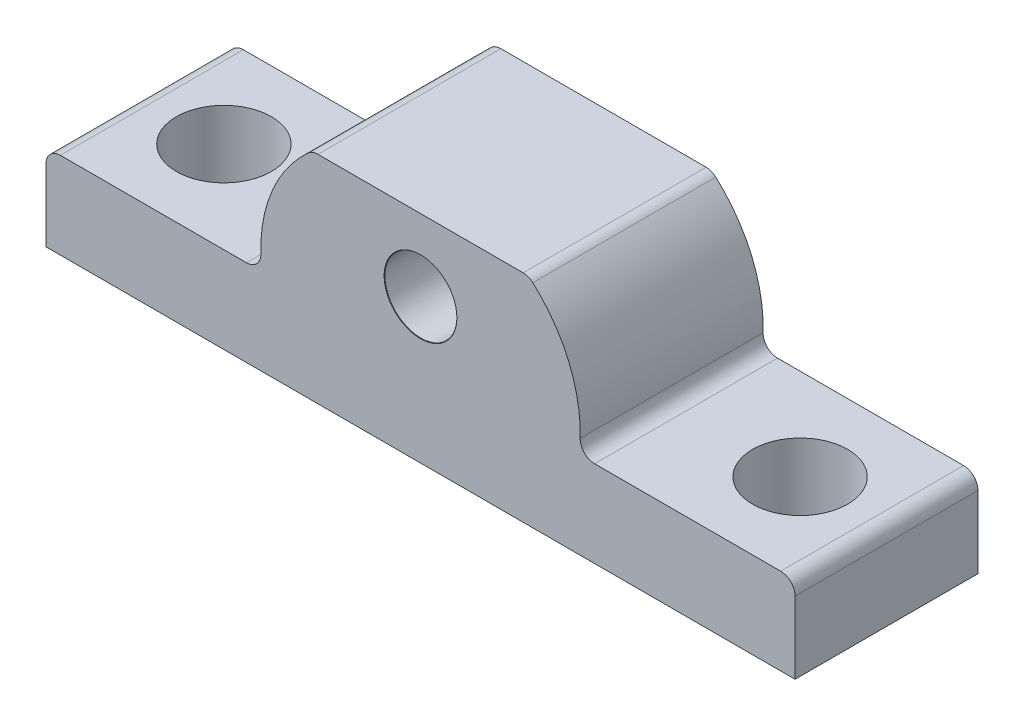
ISO-10303-21;
HEADER;
FILE_DESCRIPTION(('STEP AP214'),'2;1');
FILE_NAME('part.step','',(''),(''),'','','');
FILE_SCHEMA(('AUTOMOTIVE_DESIGN { 1 0 10303 214 1 1 1 1 }'));
ENDSEC;
DATA;
#1=APPLICATION_CONTEXT('core data for automotive mechanical design processes');
#2=APPLICATION_PROTOCOL_DEFINITION('international standard','automotive_design',2000,#1);
#3=PRODUCT_CONTEXT('',#1,'mechanical');
#4=PRODUCT('Part','Part','',(#3));
#5=PRODUCT_RELATED_PRODUCT_CATEGORY('part','',(#4));
#6=PRODUCT_DEFINITION_FORMATION('','',#4);
#7=PRODUCT_DEFINITION_CONTEXT('part definition',#1,'design');
#8=PRODUCT_DEFINITION('design','',#6,#7);
#9=PRODUCT_DEFINITION_SHAPE('','',#8);
#10=(LENGTH_UNIT() NAMED_UNIT(*) SI_UNIT(.MILLI.,.METRE.));
#11=(NAMED_UNIT(*) PLANE_ANGLE_UNIT() SI_UNIT($,.RADIAN.));
#12=(NAMED_UNIT(*) SI_UNIT($,.STERADIAN.) SOLID_ANGLE_UNIT());
#13=UNCERTAINTY_MEASURE_WITH_UNIT(LENGTH_MEASURE(1.E-05),#10,'distance_accuracy_value','');
#14=(GEOMETRIC_REPRESENTATION_CONTEXT(3) GLOBAL_UNCERTAINTY_ASSIGNED_CONTEXT((#13)) GLOBAL_UNIT_ASSIGNED_CONTEXT((#10,
#11,#12)) REPRESENTATION_CONTEXT('',''));
#15=CARTESIAN_POINT('',(0.,0.,0.));
#16=DIRECTION('',(0.,0.,1.));
#17=DIRECTION('',(1.,0.,0.));
#18=AXIS2_PLACEMENT_3D('',#15,#16,#17);
#19=CARTESIAN_POINT('',(-1.08830466278728,7.32600736886172,-12.7));
#20=DIRECTION('',(0.,0.,-1.));
#21=DIRECTION('',(-1.,0.,0.));
#22=AXIS2_PLACEMENT_3D('',#19,#20,#21);
#23=PLANE('',#22);
#24=DIRECTION('',(-1.,0.,0.));
#25=VECTOR('',#24,1.);
#26=CARTESIAN_POINT('',(26.,6.00000000000001,-12.7));
#27=LINE('',#26,#25);
#28=CARTESIAN_POINT('',(25.,6.00000000000001,-12.7));
#29=VERTEX_POINT('',#28);
#30=CARTESIAN_POINT('',(12.0834726558399,6.,-12.7));
#31=VERTEX_POINT('',#30);
#32=EDGE_CURVE('E166',#29,#31,#27,.T.);
#33=ORIENTED_EDGE('',*,*,#32,.F.);
#34=CARTESIAN_POINT('',(25.,5.00000000000001,-12.7));
#35=DIRECTION('',(0.,0.,-1.));
#36=DIRECTION('',(-1.,0.,0.));
#37=AXIS2_PLACEMENT_3D('',#34,#35,#36);
#38=CIRCLE('',#37,1.);
#39=CARTESIAN_POINT('',(26.,5.00000000000001,-12.7));
#40=VERTEX_POINT('',#39);
#41=EDGE_CURVE('E164',#29,#40,#38,.T.);
#42=ORIENTED_EDGE('',*,*,#41,.T.);
#43=DIRECTION('',(0.,1.,0.));
#44=VECTOR('',#43,1.);
#45=CARTESIAN_POINT('',(26.,0.,-12.7));
#46=LINE('',#45,#44);
#47=CARTESIAN_POINT('',(26.,0.,-12.7));
#48=VERTEX_POINT('',#47);
#49=EDGE_CURVE('E147',#48,#40,#46,.T.);
#50=ORIENTED_EDGE('',*,*,#49,.F.);
#51=DIRECTION('',(1.,0.,0.));
#52=VECTOR('',#51,1.);
#53=CARTESIAN_POINT('',(-26.,0.,-12.7));
#54=LINE('',#53,#52);
#55=CARTESIAN_POINT('',(-26.,0.,-12.7));
#56=VERTEX_POINT('',#55);
#57=EDGE_CURVE('E162',#56,#48,#54,.T.);
#58=ORIENTED_EDGE('',*,*,#57,.F.);
#59=DIRECTION('',(0.,1.,0.));
#60=VECTOR('',#59,1.);
#61=CARTESIAN_POINT('',(-26.,0.,-12.7));
#62=LINE('',#61,#60);
#63=CARTESIAN_POINT('',(-26.,5.,-12.7));
#64=VERTEX_POINT('',#63);
#65=EDGE_CURVE('E170',#56,#64,#62,.T.);
#66=ORIENTED_EDGE('',*,*,#65,.T.);
#67=CARTESIAN_POINT('',(-25.,5.,-12.7));
#68=DIRECTION('',(0.,0.,-1.));
#69=DIRECTION('',(-1.,0.,0.));
#70=AXIS2_PLACEMENT_3D('',#67,#68,#69);
#71=CIRCLE('',#70,1.);
#72=CARTESIAN_POINT('',(-25.,6.,-12.7));
#73=VERTEX_POINT('',#72);
#74=EDGE_CURVE('E246',#64,#73,#71,.T.);
#75=ORIENTED_EDGE('',*,*,#74,.T.);
#76=DIRECTION('',(1.,0.,0.));
#77=VECTOR('',#76,1.);
#78=CARTESIAN_POINT('',(-26.,6.,-12.7));
#79=LINE('',#78,#77);
#80=CARTESIAN_POINT('',(-12.0834726558399,6.,-12.7));
#81=VERTEX_POINT('',#80);
#82=EDGE_CURVE('E205',#73,#81,#79,.T.);
#83=ORIENTED_EDGE('',*,*,#82,.T.);
#84=CARTESIAN_POINT('',(-12.0834726558399,7.,-12.7));
#85=DIRECTION('',(0.,0.,-1.));
#86=DIRECTION('',(-1.,0.,0.));
#87=AXIS2_PLACEMENT_3D('',#84,#85,#86);
#88=CIRCLE('',#87,1.);
#89=CARTESIAN_POINT('',(-11.0839119291987,7.02963703353288,-12.7));
#90=VERTEX_POINT('',#89);
#91=EDGE_CURVE('E11',#81,#90,#88,.F.);
#92=ORIENTED_EDGE('',*,*,#91,.T.);
#93=CARTESIAN_POINT('',(-1.08830466278728,7.32600736886172,-12.7));
#94=DIRECTION('',(0.,0.,-1.));
#95=DIRECTION('',(-1.,0.,0.));
#96=AXIS2_PLACEMENT_3D('',#93,#94,#95);
#97=CIRCLE('',#96,10.);
#98=CARTESIAN_POINT('',(-7.79722836439287,14.7415547367931,-12.7));
#99=VERTEX_POINT('',#98);
#100=EDGE_CURVE('E302',#90,#99,#97,.T.);
#101=ORIENTED_EDGE('',*,*,#100,.T.);
#102=CARTESIAN_POINT('',(-7.12633599423231,14.,-12.7));
#103=DIRECTION('',(0.,0.,-1.));
#104=DIRECTION('',(-1.,0.,0.));
#105=AXIS2_PLACEMENT_3D('',#102,#103,#104);
#106=CIRCLE('',#105,1.);
#107=CARTESIAN_POINT('',(-7.12633599423231,15.,-12.7));
#108=VERTEX_POINT('',#107);
#109=EDGE_CURVE('E243',#99,#108,#106,.T.);
#110=ORIENTED_EDGE('',*,*,#109,.T.);
#111=DIRECTION('',(-1.,0.,0.));
#112=VECTOR('',#111,1.);
#113=CARTESIAN_POINT('',(7.5,15.,-12.7));
#114=LINE('',#113,#112);
#115=CARTESIAN_POINT('',(7.12633599423231,15.,-12.7));
#116=VERTEX_POINT('',#115);
#117=EDGE_CURVE('E308',#116,#108,#114,.T.);
#118=ORIENTED_EDGE('',*,*,#117,.F.);
#119=CARTESIAN_POINT('',(7.12633599423231,14.,-12.7));
#120=DIRECTION('',(0.,0.,-1.));
#121=DIRECTION('',(-1.,0.,0.));
#122=AXIS2_PLACEMENT_3D('',#119,#120,#121);
#123=CIRCLE('',#122,1.);
#124=CARTESIAN_POINT('',(7.79722836439287,14.7415547367931,-12.7));
#125=VERTEX_POINT('',#124);
#126=EDGE_CURVE('E62',#116,#125,#123,.T.);
#127=ORIENTED_EDGE('',*,*,#126,.T.);
#128=CARTESIAN_POINT('',(1.08830466278727,7.32600736886172,-12.7));
#129=DIRECTION('',(0.,0.,1.));
#130=DIRECTION('',(1.,0.,0.));
#131=AXIS2_PLACEMENT_3D('',#128,#129,#130);
#132=CIRCLE('',#131,10.);
#133=CARTESIAN_POINT('',(11.0839119291987,7.02963703353289,-12.7));
#134=VERTEX_POINT('',#133);
#135=EDGE_CURVE('E313',#134,#125,#132,.T.);
#136=ORIENTED_EDGE('',*,*,#135,.F.);
#137=CARTESIAN_POINT('',(12.0834726558399,7.,-12.7));
#138=DIRECTION('',(0.,0.,-1.));
#139=DIRECTION('',(-1.,0.,0.));
#140=AXIS2_PLACEMENT_3D('',#137,#138,#139);
#141=CIRCLE('',#140,1.);
#142=EDGE_CURVE('E284',#134,#31,#141,.F.);
#143=ORIENTED_EDGE('',*,*,#142,.T.);
#144=EDGE_LOOP('',(#33,#42,#50,#58,#66,#75,#83,#92,#101,#110,#118,#127,#136,#143));
#145=FACE_BOUND('',#144,.T.);
#146=CARTESIAN_POINT('',(0.,10.,-12.7));
#147=DIRECTION('',(0.,0.,1.));
#148=DIRECTION('',(1.,0.,0.));
#149=AXIS2_PLACEMENT_3D('',#146,#147,#148);
#150=CIRCLE('',#149,2.5);
#151=CARTESIAN_POINT('',(2.5,10.,-12.7));
#152=VERTEX_POINT('',#151);
#153=EDGE_CURVE('E181',#152,#152,#150,.T.);
#154=ORIENTED_EDGE('',*,*,#153,.T.);
#155=EDGE_LOOP('',(#154));
#156=FACE_BOUND('',#155,.T.);
#157=ADVANCED_FACE('F38',(#145,#156),#23,.T.);
#158=CARTESIAN_POINT('',(-26.,6.,-12.7));
#159=DIRECTION('',(0.,-1.,0.));
#160=DIRECTION('',(0.,0.,-1.));
#161=AXIS2_PLACEMENT_3D('',#158,#159,#160);
#162=PLANE('',#161);
#163=CARTESIAN_POINT('',(-20.,6.,-6.35));
#164=DIRECTION('',(0.,-1.,0.));
#165=DIRECTION('',(0.,0.,-1.));
#166=AXIS2_PLACEMENT_3D('',#163,#164,#165);
#167=CIRCLE('',#166,3.3);
#168=CARTESIAN_POINT('',(-20.,6.,-9.65));
#169=VERTEX_POINT('',#168);
#170=EDGE_CURVE('E214',#169,#169,#167,.T.);
#171=ORIENTED_EDGE('',*,*,#170,.T.);
#172=EDGE_LOOP('',(#171));
#173=FACE_BOUND('',#172,.T.);
#174=ORIENTED_EDGE('',*,*,#82,.F.);
#175=DIRECTION('',(0.,0.,1.));
#176=VECTOR('',#175,1.);
#177=CARTESIAN_POINT('',(-25.,6.,-12.7));
#178=LINE('',#177,#176);
#179=CARTESIAN_POINT('',(-25.,6.,0.));
#180=VERTEX_POINT('',#179);
#181=EDGE_CURVE('E254',#73,#180,#178,.T.);
#182=ORIENTED_EDGE('',*,*,#181,.T.);
#183=DIRECTION('',(1.,0.,0.));
#184=VECTOR('',#183,1.);
#185=CARTESIAN_POINT('',(-26.,6.,0.));
#186=LINE('',#185,#184);
#187=CARTESIAN_POINT('',(-12.0834726558399,6.,0.));
#188=VERTEX_POINT('',#187);
#189=EDGE_CURVE('E176',#180,#188,#186,.T.);
#190=ORIENTED_EDGE('',*,*,#189,.T.);
#191=DIRECTION('',(0.,0.,-1.));
#192=VECTOR('',#191,1.);
#193=CARTESIAN_POINT('',(-12.0834726558399,6.,-12.7));
#194=LINE('',#193,#192);
#195=EDGE_CURVE('E251',#188,#81,#194,.T.);
#196=ORIENTED_EDGE('',*,*,#195,.T.);
#197=EDGE_LOOP('',(#174,#182,#190,#196));
#198=FACE_BOUND('',#197,.T.);
#199=ADVANCED_FACE('F296',(#173,#198),#162,.F.);
#200=CARTESIAN_POINT('',(-1.08830466278728,7.32600736886172,-12.7));
#201=DIRECTION('',(0.,0.,1.));
#202=DIRECTION('',(1.,0.,0.));
#203=AXIS2_PLACEMENT_3D('',#200,#201,#202);
#204=CYLINDRICAL_SURFACE('',#203,10.);
#205=CARTESIAN_POINT('',(-1.08830466278728,7.32600736886172,0.));
#206=DIRECTION('',(0.,0.,-1.));
#207=DIRECTION('',(-1.,0.,0.));
#208=AXIS2_PLACEMENT_3D('',#205,#206,#207);
#209=CIRCLE('',#208,10.);
#210=CARTESIAN_POINT('',(-11.0839119291987,7.02963703353288,0.));
#211=VERTEX_POINT('',#210);
#212=CARTESIAN_POINT('',(-7.79722836439287,14.7415547367931,0.));
#213=VERTEX_POINT('',#212);
#214=EDGE_CURVE('E180',#211,#213,#209,.T.);
#215=ORIENTED_EDGE('',*,*,#214,.T.);
#216=DIRECTION('',(0.,0.,1.));
#217=VECTOR('',#216,1.);
#218=CARTESIAN_POINT('',(-7.79722836439287,14.7415547367931,-12.7));
#219=LINE('',#218,#217);
#220=EDGE_CURVE('E271',#213,#99,#219,.F.);
#221=ORIENTED_EDGE('',*,*,#220,.T.);
#222=ORIENTED_EDGE('',*,*,#100,.F.);
#223=DIRECTION('',(0.,0.,1.));
#224=VECTOR('',#223,1.);
#225=CARTESIAN_POINT('',(-11.0839119291987,7.02963703353288,-12.7));
#226=LINE('',#225,#224);
#227=EDGE_CURVE('E267',#90,#211,#226,.T.);
#228=ORIENTED_EDGE('',*,*,#227,.T.);
#229=EDGE_LOOP('',(#215,#221,#222,#228));
#230=FACE_BOUND('',#229,.T.);
#231=ADVANCED_FACE('F305',(#230),#204,.T.);
#232=CARTESIAN_POINT('',(7.5,15.,-12.7));
#233=DIRECTION('',(0.,1.,0.));
#234=DIRECTION('',(0.,0.,1.));
#235=AXIS2_PLACEMENT_3D('',#232,#233,#234);
#236=PLANE('',#235);
#237=ORIENTED_EDGE('',*,*,#117,.T.);
#238=DIRECTION('',(0.,0.,-1.));
#239=VECTOR('',#238,1.);
#240=CARTESIAN_POINT('',(-7.12633599423231,15.,0.));
#241=LINE('',#240,#239);
#242=CARTESIAN_POINT('',(-7.12633599423231,15.,0.));
#243=VERTEX_POINT('',#242);
#244=EDGE_CURVE('E263',#108,#243,#241,.F.);
#245=ORIENTED_EDGE('',*,*,#244,.T.);
#246=DIRECTION('',(-1.,0.,0.));
#247=VECTOR('',#246,1.);
#248=CARTESIAN_POINT('',(7.5,15.,0.));
#249=LINE('',#248,#247);
#250=CARTESIAN_POINT('',(7.12633599423231,15.,0.));
#251=VERTEX_POINT('',#250);
#252=EDGE_CURVE('E185',#251,#243,#249,.T.);
#253=ORIENTED_EDGE('',*,*,#252,.F.);
#254=DIRECTION('',(0.,0.,1.));
#255=VECTOR('',#254,1.);
#256=CARTESIAN_POINT('',(7.12633599423231,15.,-12.7));
#257=LINE('',#256,#255);
#258=EDGE_CURVE('E260',#251,#116,#257,.F.);
#259=ORIENTED_EDGE('',*,*,#258,.T.);
#260=EDGE_LOOP('',(#237,#245,#253,#259));
#261=FACE_BOUND('',#260,.T.);
#262=ADVANCED_FACE('F339',(#261),#236,.T.);
#263=CARTESIAN_POINT('',(1.08830466278727,7.32600736886172,-12.7));
#264=DIRECTION('',(0.,0.,1.));
#265=DIRECTION('',(1.,0.,0.));
#266=AXIS2_PLACEMENT_3D('',#263,#264,#265);
#267=CYLINDRICAL_SURFACE('',#266,10.);
#268=ORIENTED_EDGE('',*,*,#135,.T.);
#269=DIRECTION('',(0.,0.,1.));
#270=VECTOR('',#269,1.);
#271=CARTESIAN_POINT('',(7.79722836439287,14.7415547367931,-12.7));
#272=LINE('',#271,#270);
#273=CARTESIAN_POINT('',(7.79722836439287,14.7415547367931,0.));
#274=VERTEX_POINT('',#273);
#275=EDGE_CURVE('E277',#125,#274,#272,.T.);
#276=ORIENTED_EDGE('',*,*,#275,.T.);
#277=CARTESIAN_POINT('',(1.08830466278727,7.32600736886172,0.));
#278=DIRECTION('',(0.,0.,1.));
#279=DIRECTION('',(1.,0.,0.));
#280=AXIS2_PLACEMENT_3D('',#277,#278,#279);
#281=CIRCLE('',#280,10.);
#282=CARTESIAN_POINT('',(11.0839119291987,7.02963703353289,0.));
#283=VERTEX_POINT('',#282);
#284=EDGE_CURVE('E189',#283,#274,#281,.T.);
#285=ORIENTED_EDGE('',*,*,#284,.F.);
#286=DIRECTION('',(0.,0.,1.));
#287=VECTOR('',#286,1.);
#288=CARTESIAN_POINT('',(11.0839119291987,7.02963703353289,-12.7));
#289=LINE('',#288,#287);
#290=EDGE_CURVE('E274',#283,#134,#289,.F.);
#291=ORIENTED_EDGE('',*,*,#290,.T.);
#292=EDGE_LOOP('',(#268,#276,#285,#291));
#293=FACE_BOUND('',#292,.T.);
#294=ADVANCED_FACE('F332',(#293),#267,.T.);
#295=CARTESIAN_POINT('',(26.,6.00000000000001,-12.7));
#296=DIRECTION('',(0.,1.,0.));
#297=DIRECTION('',(-1.,0.,0.));
#298=AXIS2_PLACEMENT_3D('',#295,#296,#297);
#299=PLANE('',#298);
#300=CARTESIAN_POINT('',(20.,6.00000000000001,-6.34999999999999));
#301=DIRECTION('',(0.,1.,0.));
#302=DIRECTION('',(-1.,0.,0.));
#303=AXIS2_PLACEMENT_3D('',#300,#301,#302);
#304=CIRCLE('',#303,3.3);
#305=CARTESIAN_POINT('',(16.7,6.00000000000001,-6.34999999999999));
#306=VERTEX_POINT('',#305);
#307=EDGE_CURVE('E208',#306,#306,#304,.T.);
#308=ORIENTED_EDGE('',*,*,#307,.F.);
#309=EDGE_LOOP('',(#308));
#310=FACE_BOUND('',#309,.T.);
#311=DIRECTION('',(-1.,0.,0.));
#312=VECTOR('',#311,1.);
#313=CARTESIAN_POINT('',(26.,6.00000000000001,0.));
#314=LINE('',#313,#312);
#315=CARTESIAN_POINT('',(25.,6.00000000000001,0.));
#316=VERTEX_POINT('',#315);
#317=CARTESIAN_POINT('',(12.0834726558399,6.,0.));
#318=VERTEX_POINT('',#317);
#319=EDGE_CURVE('E193',#316,#318,#314,.T.);
#320=ORIENTED_EDGE('',*,*,#319,.F.);
#321=DIRECTION('',(0.,0.,1.));
#322=VECTOR('',#321,1.);
#323=CARTESIAN_POINT('',(25.,6.00000000000001,-12.7));
#324=LINE('',#323,#322);
#325=EDGE_CURVE('E238',#316,#29,#324,.F.);
#326=ORIENTED_EDGE('',*,*,#325,.T.);
#327=ORIENTED_EDGE('',*,*,#32,.T.);
#328=DIRECTION('',(0.,0.,-1.));
#329=VECTOR('',#328,1.);
#330=CARTESIAN_POINT('',(12.0834726558399,6.00000000000001,0.));
#331=LINE('',#330,#329);
#332=EDGE_CURVE('E234',#31,#318,#331,.F.);
#333=ORIENTED_EDGE('',*,*,#332,.T.);
#334=EDGE_LOOP('',(#320,#326,#327,#333));
#335=FACE_BOUND('',#334,.T.);
#336=ADVANCED_FACE('F324',(#310,#335),#299,.T.);
#337=CARTESIAN_POINT('',(26.,0.,-12.7));
#338=DIRECTION('',(1.,0.,0.));
#339=DIRECTION('',(0.,0.,-1.));
#340=AXIS2_PLACEMENT_3D('',#337,#338,#339);
#341=PLANE('',#340);
#342=ORIENTED_EDGE('',*,*,#49,.T.);
#343=DIRECTION('',(0.,0.,1.));
#344=VECTOR('',#343,1.);
#345=CARTESIAN_POINT('',(26.,5.00000000000001,-12.7));
#346=LINE('',#345,#344);
#347=CARTESIAN_POINT('',(26.,5.00000000000001,0.));
#348=VERTEX_POINT('',#347);
#349=EDGE_CURVE('E156',#40,#348,#346,.T.);
#350=ORIENTED_EDGE('',*,*,#349,.T.);
#351=DIRECTION('',(0.,1.,0.));
#352=VECTOR('',#351,1.);
#353=CARTESIAN_POINT('',(26.,0.,0.));
#354=LINE('',#353,#352);
#355=CARTESIAN_POINT('',(26.,0.,0.));
#356=VERTEX_POINT('',#355);
#357=EDGE_CURVE('E150',#356,#348,#354,.T.);
#358=ORIENTED_EDGE('',*,*,#357,.F.);
#359=DIRECTION('',(0.,0.,1.));
#360=VECTOR('',#359,1.);
#361=CARTESIAN_POINT('',(26.,0.,-12.7));
#362=LINE('',#361,#360);
#363=EDGE_CURVE('E143',#48,#356,#362,.T.);
#364=ORIENTED_EDGE('',*,*,#363,.F.);
#365=EDGE_LOOP('',(#342,#350,#358,#364));
#366=FACE_BOUND('',#365,.T.);
#367=ADVANCED_FACE('F145',(#366),#341,.T.);
#368=CARTESIAN_POINT('',(-26.,0.,-12.7));
#369=DIRECTION('',(0.,-1.,0.));
#370=DIRECTION('',(1.,0.,0.));
#371=AXIS2_PLACEMENT_3D('',#368,#369,#370);
#372=PLANE('',#371);
#373=CARTESIAN_POINT('',(-20.,0.,-6.35));
#374=DIRECTION('',(0.,-1.,0.));
#375=DIRECTION('',(0.,0.,-1.));
#376=AXIS2_PLACEMENT_3D('',#373,#374,#375);
#377=CIRCLE('',#376,3.325);
#378=CARTESIAN_POINT('',(-20.,0.,-9.675));
#379=VERTEX_POINT('',#378);
#380=EDGE_CURVE('E442',#379,#379,#377,.T.);
#381=ORIENTED_EDGE('',*,*,#380,.F.);
#382=EDGE_LOOP('',(#381));
#383=FACE_BOUND('',#382,.T.);
#384=CARTESIAN_POINT('',(20.,0.,-6.34999999999999));
#385=DIRECTION('',(0.,-1.,0.));
#386=DIRECTION('',(0.,0.,-1.));
#387=AXIS2_PLACEMENT_3D('',#384,#385,#386);
#388=CIRCLE('',#387,3.325);
#389=CARTESIAN_POINT('',(20.,0.,-9.675));
#390=VERTEX_POINT('',#389);
#391=EDGE_CURVE('E218',#390,#390,#388,.T.);
#392=ORIENTED_EDGE('',*,*,#391,.F.);
#393=EDGE_LOOP('',(#392));
#394=FACE_BOUND('',#393,.T.);
#395=DIRECTION('',(1.,0.,0.));
#396=VECTOR('',#395,1.);
#397=CARTESIAN_POINT('',(-26.,0.,0.));
#398=LINE('',#397,#396);
#399=CARTESIAN_POINT('',(-26.,0.,0.));
#400=VERTEX_POINT('',#399);
#401=EDGE_CURVE('E199',#400,#356,#398,.T.);
#402=ORIENTED_EDGE('',*,*,#401,.F.);
#403=DIRECTION('',(0.,0.,1.));
#404=VECTOR('',#403,1.);
#405=CARTESIAN_POINT('',(-26.,0.,-12.7));
#406=LINE('',#405,#404);
#407=EDGE_CURVE('E157',#56,#400,#406,.T.);
#408=ORIENTED_EDGE('',*,*,#407,.F.);
#409=ORIENTED_EDGE('',*,*,#57,.T.);
#410=ORIENTED_EDGE('',*,*,#363,.T.);
#411=EDGE_LOOP('',(#402,#408,#409,#410));
#412=FACE_BOUND('',#411,.T.);
#413=ADVANCED_FACE('F168',(#383,#394,#412),#372,.T.);
#414=CARTESIAN_POINT('',(-26.,0.,-12.7));
#415=DIRECTION('',(1.,0.,0.));
#416=DIRECTION('',(0.,0.,-1.));
#417=AXIS2_PLACEMENT_3D('',#414,#415,#416);
#418=PLANE('',#417);
#419=DIRECTION('',(0.,1.,0.));
#420=VECTOR('',#419,1.);
#421=CARTESIAN_POINT('',(-26.,0.,0.));
#422=LINE('',#421,#420);
#423=CARTESIAN_POINT('',(-26.,5.,0.));
#424=VERTEX_POINT('',#423);
#425=EDGE_CURVE('E202',#400,#424,#422,.T.);
#426=ORIENTED_EDGE('',*,*,#425,.T.);
#427=DIRECTION('',(0.,0.,1.));
#428=VECTOR('',#427,1.);
#429=CARTESIAN_POINT('',(-26.,5.,-12.7));
#430=LINE('',#429,#428);
#431=EDGE_CURVE('E54',#424,#64,#430,.F.);
#432=ORIENTED_EDGE('',*,*,#431,.T.);
#433=ORIENTED_EDGE('',*,*,#65,.F.);
#434=ORIENTED_EDGE('',*,*,#407,.T.);
#435=EDGE_LOOP('',(#426,#432,#433,#434));
#436=FACE_BOUND('',#435,.T.);
#437=ADVANCED_FACE('F368',(#436),#418,.F.);
#438=CARTESIAN_POINT('',(-1.08830466278728,7.32600736886172,0.));
#439=DIRECTION('',(0.,0.,-1.));
#440=DIRECTION('',(-1.,0.,0.));
#441=AXIS2_PLACEMENT_3D('',#438,#439,#440);
#442=PLANE('',#441);
#443=CARTESIAN_POINT('',(0.,10.,0.));
#444=DIRECTION('',(0.,0.,1.));
#445=DIRECTION('',(1.,0.,0.));
#446=AXIS2_PLACEMENT_3D('',#443,#444,#445);
#447=CIRCLE('',#446,2.525);
#448=CARTESIAN_POINT('',(2.525,10.,0.));
#449=VERTEX_POINT('',#448);
#450=EDGE_CURVE('E212',#449,#449,#447,.T.);
#451=ORIENTED_EDGE('',*,*,#450,.F.);
#452=EDGE_LOOP('',(#451));
#453=FACE_BOUND('',#452,.T.);
#454=ORIENTED_EDGE('',*,*,#357,.T.);
#455=CARTESIAN_POINT('',(25.,5.00000000000001,0.));
#456=DIRECTION('',(0.,0.,-1.));
#457=DIRECTION('',(-1.,0.,0.));
#458=AXIS2_PLACEMENT_3D('',#455,#456,#457);
#459=CIRCLE('',#458,1.);
#460=EDGE_CURVE('E231',#348,#316,#459,.F.);
#461=ORIENTED_EDGE('',*,*,#460,.T.);
#462=ORIENTED_EDGE('',*,*,#319,.T.);
#463=CARTESIAN_POINT('',(12.0834726558399,7.,0.));
#464=DIRECTION('',(0.,0.,-1.));
#465=DIRECTION('',(-1.,0.,0.));
#466=AXIS2_PLACEMENT_3D('',#463,#464,#465);
#467=CIRCLE('',#466,1.);
#468=EDGE_CURVE('E281',#318,#283,#467,.T.);
#469=ORIENTED_EDGE('',*,*,#468,.T.);
#470=ORIENTED_EDGE('',*,*,#284,.T.);
#471=CARTESIAN_POINT('',(7.12633599423231,14.,0.));
#472=DIRECTION('',(0.,0.,-1.));
#473=DIRECTION('',(-1.,0.,0.));
#474=AXIS2_PLACEMENT_3D('',#471,#472,#473);
#475=CIRCLE('',#474,1.);
#476=EDGE_CURVE('E222',#274,#251,#475,.F.);
#477=ORIENTED_EDGE('',*,*,#476,.T.);
#478=ORIENTED_EDGE('',*,*,#252,.T.);
#479=CARTESIAN_POINT('',(-7.12633599423231,14.,0.));
#480=DIRECTION('',(0.,0.,-1.));
#481=DIRECTION('',(-1.,0.,0.));
#482=AXIS2_PLACEMENT_3D('',#479,#480,#481);
#483=CIRCLE('',#482,1.);
#484=EDGE_CURVE('E225',#243,#213,#483,.F.);
#485=ORIENTED_EDGE('',*,*,#484,.T.);
#486=ORIENTED_EDGE('',*,*,#214,.F.);
#487=CARTESIAN_POINT('',(-12.0834726558399,7.,0.));
#488=DIRECTION('',(0.,0.,-1.));
#489=DIRECTION('',(-1.,0.,0.));
#490=AXIS2_PLACEMENT_3D('',#487,#488,#489);
#491=CIRCLE('',#490,1.);
#492=EDGE_CURVE('E47',#211,#188,#491,.T.);
#493=ORIENTED_EDGE('',*,*,#492,.T.);
#494=ORIENTED_EDGE('',*,*,#189,.F.);
#495=CARTESIAN_POINT('',(-25.,5.,0.));
#496=DIRECTION('',(0.,0.,-1.));
#497=DIRECTION('',(-1.,0.,0.));
#498=AXIS2_PLACEMENT_3D('',#495,#496,#497);
#499=CIRCLE('',#498,1.);
#500=EDGE_CURVE('E228',#180,#424,#499,.F.);
#501=ORIENTED_EDGE('',*,*,#500,.T.);
#502=ORIENTED_EDGE('',*,*,#425,.F.);
#503=ORIENTED_EDGE('',*,*,#401,.T.);
#504=EDGE_LOOP('',(#454,#461,#462,#469,#470,#477,#478,#485,#486,#493,#494,#501,#502,#503));
#505=FACE_BOUND('',#504,.T.);
#506=ADVANCED_FACE('F290',(#453,#505),#442,.F.);
#507=CARTESIAN_POINT('',(0.,10.,0.));
#508=DIRECTION('',(0.,0.,1.));
#509=DIRECTION('',(1.,0.,0.));
#510=AXIS2_PLACEMENT_3D('',#507,#508,#509);
#511=CYLINDRICAL_SURFACE('',#510,2.5);
#512=ORIENTED_EDGE('',*,*,#153,.F.);
#513=EDGE_LOOP('',(#512));
#514=FACE_BOUND('',#513,.T.);
#515=CARTESIAN_POINT('',(0.,10.,-0.024999999999999));
#516=DIRECTION('',(0.,0.,1.));
#517=DIRECTION('',(1.,0.,0.));
#518=AXIS2_PLACEMENT_3D('',#515,#516,#517);
#519=CIRCLE('',#518,2.5);
#520=CARTESIAN_POINT('',(2.5,10.,-0.024999999999999));
#521=VERTEX_POINT('',#520);
#522=EDGE_CURVE('E421',#521,#521,#519,.T.);
#523=ORIENTED_EDGE('',*,*,#522,.T.);
#524=EDGE_LOOP('',(#523));
#525=FACE_BOUND('',#524,.T.);
#526=ADVANCED_FACE('F364',(#514,#525),#511,.F.);
#527=CARTESIAN_POINT('',(0.,10.,0.));
#528=DIRECTION('',(0.,0.,1.));
#529=DIRECTION('',(1.,0.,0.));
#530=AXIS2_PLACEMENT_3D('',#527,#528,#529);
#531=CONICAL_SURFACE('',#530,2.525,0.785398163397431);
#532=ORIENTED_EDGE('',*,*,#522,.F.);
#533=EDGE_LOOP('',(#532));
#534=FACE_BOUND('',#533,.T.);
#535=ORIENTED_EDGE('',*,*,#450,.T.);
#536=EDGE_LOOP('',(#535));
#537=FACE_BOUND('',#536,.T.);
#538=ADVANCED_FACE('F410',(#534,#537),#531,.F.);
#539=CARTESIAN_POINT('',(20.,0.,-6.34999999999999));
#540=DIRECTION('',(0.,-1.,0.));
#541=DIRECTION('',(0.,0.,-1.));
#542=AXIS2_PLACEMENT_3D('',#539,#540,#541);
#543=CYLINDRICAL_SURFACE('',#542,3.3);
#544=ORIENTED_EDGE('',*,*,#307,.T.);
#545=EDGE_LOOP('',(#544));
#546=FACE_BOUND('',#545,.T.);
#547=CARTESIAN_POINT('',(20.,0.0250000000000044,-6.34999999999999));
#548=DIRECTION('',(0.,-1.,0.));
#549=DIRECTION('',(0.,0.,-1.));
#550=AXIS2_PLACEMENT_3D('',#547,#548,#549);
#551=CIRCLE('',#550,3.3);
#552=CARTESIAN_POINT('',(20.,0.0250000000000044,-9.65));
#553=VERTEX_POINT('',#552);
#554=EDGE_CURVE('E213',#553,#553,#551,.T.);
#555=ORIENTED_EDGE('',*,*,#554,.T.);
#556=EDGE_LOOP('',(#555));
#557=FACE_BOUND('',#556,.T.);
#558=ADVANCED_FACE('F407',(#546,#557),#543,.F.);
#559=CARTESIAN_POINT('',(20.,0.,-6.34999999999999));
#560=DIRECTION('',(0.,-1.,0.));
#561=DIRECTION('',(0.,0.,-1.));
#562=AXIS2_PLACEMENT_3D('',#559,#560,#561);
#563=CONICAL_SURFACE('',#562,3.325,0.785398163397448);
#564=ORIENTED_EDGE('',*,*,#554,.F.);
#565=EDGE_LOOP('',(#564));
#566=FACE_BOUND('',#565,.T.);
#567=ORIENTED_EDGE('',*,*,#391,.T.);
#568=EDGE_LOOP('',(#567));
#569=FACE_BOUND('',#568,.T.);
#570=ADVANCED_FACE('F399',(#566,#569),#563,.F.);
#571=CARTESIAN_POINT('',(-20.,0.,-6.35));
#572=DIRECTION('',(0.,-1.,0.));
#573=DIRECTION('',(0.,0.,-1.));
#574=AXIS2_PLACEMENT_3D('',#571,#572,#573);
#575=CYLINDRICAL_SURFACE('',#574,3.3);
#576=CARTESIAN_POINT('',(-20.,0.024999999999997,-6.35));
#577=DIRECTION('',(0.,-1.,0.));
#578=DIRECTION('',(0.,0.,-1.));
#579=AXIS2_PLACEMENT_3D('',#576,#577,#578);
#580=CIRCLE('',#579,3.3);
#581=CARTESIAN_POINT('',(-20.,0.024999999999997,-9.65));
#582=VERTEX_POINT('',#581);
#583=EDGE_CURVE('E219',#582,#582,#580,.T.);
#584=ORIENTED_EDGE('',*,*,#583,.T.);
#585=EDGE_LOOP('',(#584));
#586=FACE_BOUND('',#585,.T.);
#587=ORIENTED_EDGE('',*,*,#170,.F.);
#588=EDGE_LOOP('',(#587));
#589=FACE_BOUND('',#588,.T.);
#590=ADVANCED_FACE('F392',(#586,#589),#575,.F.);
#591=CARTESIAN_POINT('',(-20.,0.,-6.35));
#592=DIRECTION('',(0.,-1.,0.));
#593=DIRECTION('',(0.,0.,-1.));
#594=AXIS2_PLACEMENT_3D('',#591,#592,#593);
#595=CONICAL_SURFACE('',#594,3.325,0.785398163397448);
#596=ORIENTED_EDGE('',*,*,#583,.F.);
#597=EDGE_LOOP('',(#596));
#598=FACE_BOUND('',#597,.T.);
#599=ORIENTED_EDGE('',*,*,#380,.T.);
#600=EDGE_LOOP('',(#599));
#601=FACE_BOUND('',#600,.T.);
#602=ADVANCED_FACE('F387',(#598,#601),#595,.F.);
#603=CARTESIAN_POINT('',(25.,5.00000000000001,-12.7));
#604=DIRECTION('',(0.,0.,1.));
#605=DIRECTION('',(1.,0.,0.));
#606=AXIS2_PLACEMENT_3D('',#603,#604,#605);
#607=CYLINDRICAL_SURFACE('',#606,1.);
#608=ORIENTED_EDGE('',*,*,#41,.F.);
#609=ORIENTED_EDGE('',*,*,#325,.F.);
#610=ORIENTED_EDGE('',*,*,#460,.F.);
#611=ORIENTED_EDGE('',*,*,#349,.F.);
#612=EDGE_LOOP('',(#608,#609,#610,#611));
#613=FACE_BOUND('',#612,.T.);
#614=ADVANCED_FACE('F351',(#613),#607,.T.);
#615=CARTESIAN_POINT('',(-25.,5.,-12.7));
#616=DIRECTION('',(0.,0.,1.));
#617=DIRECTION('',(1.,0.,0.));
#618=AXIS2_PLACEMENT_3D('',#615,#616,#617);
#619=CYLINDRICAL_SURFACE('',#618,1.);
#620=ORIENTED_EDGE('',*,*,#74,.F.);
#621=ORIENTED_EDGE('',*,*,#431,.F.);
#622=ORIENTED_EDGE('',*,*,#500,.F.);
#623=ORIENTED_EDGE('',*,*,#181,.F.);
#624=EDGE_LOOP('',(#620,#621,#622,#623));
#625=FACE_BOUND('',#624,.T.);
#626=ADVANCED_FACE('F344',(#625),#619,.T.);
#627=CARTESIAN_POINT('',(-7.12633599423231,14.,-12.7));
#628=DIRECTION('',(0.,0.,1.));
#629=DIRECTION('',(1.,0.,0.));
#630=AXIS2_PLACEMENT_3D('',#627,#628,#629);
#631=CYLINDRICAL_SURFACE('',#630,1.);
#632=ORIENTED_EDGE('',*,*,#109,.F.);
#633=ORIENTED_EDGE('',*,*,#220,.F.);
#634=ORIENTED_EDGE('',*,*,#484,.F.);
#635=ORIENTED_EDGE('',*,*,#244,.F.);
#636=EDGE_LOOP('',(#632,#633,#634,#635));
#637=FACE_BOUND('',#636,.T.);
#638=ADVANCED_FACE('F342',(#637),#631,.T.);
#639=CARTESIAN_POINT('',(7.12633599423231,14.,-12.7));
#640=DIRECTION('',(0.,0.,1.));
#641=DIRECTION('',(1.,0.,0.));
#642=AXIS2_PLACEMENT_3D('',#639,#640,#641);
#643=CYLINDRICAL_SURFACE('',#642,1.);
#644=ORIENTED_EDGE('',*,*,#126,.F.);
#645=ORIENTED_EDGE('',*,*,#258,.F.);
#646=ORIENTED_EDGE('',*,*,#476,.F.);
#647=ORIENTED_EDGE('',*,*,#275,.F.);
#648=EDGE_LOOP('',(#644,#645,#646,#647));
#649=FACE_BOUND('',#648,.T.);
#650=ADVANCED_FACE('F335',(#649),#643,.T.);
#651=CARTESIAN_POINT('',(12.0834726558399,7.,-12.7));
#652=DIRECTION('',(0.,0.,1.));
#653=DIRECTION('',(1.,0.,0.));
#654=AXIS2_PLACEMENT_3D('',#651,#652,#653);
#655=CYLINDRICAL_SURFACE('',#654,1.);
#656=ORIENTED_EDGE('',*,*,#142,.F.);
#657=ORIENTED_EDGE('',*,*,#290,.F.);
#658=ORIENTED_EDGE('',*,*,#468,.F.);
#659=ORIENTED_EDGE('',*,*,#332,.F.);
#660=EDGE_LOOP('',(#656,#657,#658,#659));
#661=FACE_BOUND('',#660,.T.);
#662=ADVANCED_FACE('F328',(#661),#655,.F.);
#663=CARTESIAN_POINT('',(-12.0834726558399,7.,-12.7));
#664=DIRECTION('',(0.,0.,1.));
#665=DIRECTION('',(1.,0.,0.));
#666=AXIS2_PLACEMENT_3D('',#663,#664,#665);
#667=CYLINDRICAL_SURFACE('',#666,1.);
#668=ORIENTED_EDGE('',*,*,#91,.F.);
#669=ORIENTED_EDGE('',*,*,#195,.F.);
#670=ORIENTED_EDGE('',*,*,#492,.F.);
#671=ORIENTED_EDGE('',*,*,#227,.F.);
#672=EDGE_LOOP('',(#668,#669,#670,#671));
#673=FACE_BOUND('',#672,.T.);
#674=ADVANCED_FACE('F40',(#673),#667,.F.);
#675=CLOSED_SHELL('',(#157,#199,#231,#262,#294,#336,#367,#413,#437,#506,#526,#538,#558,#570,
#590,#602,#614,#626,#638,#650,#662,#674));
#676=MANIFOLD_SOLID_BREP('B2',#675);
#677=ADVANCED_BREP_SHAPE_REPRESENTATION('',(#18,#676),#14);
#678=SHAPE_DEFINITION_REPRESENTATION(#9,#677);
ENDSEC;
END-ISO-10303-21;
